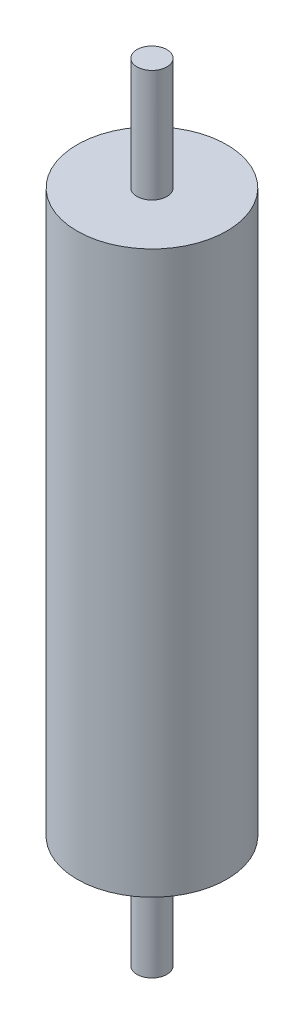
ISO-10303-21;
HEADER;
FILE_DESCRIPTION(('STEP AP214'),'2;1');
FILE_NAME('part.step','',(''),(''),'','','');
FILE_SCHEMA(('AUTOMOTIVE_DESIGN { 1 0 10303 214 1 1 1 1 }'));
ENDSEC;
DATA;
#1=APPLICATION_CONTEXT('core data for automotive mechanical design processes');
#2=APPLICATION_PROTOCOL_DEFINITION('international standard','automotive_design',2000,#1);
#3=PRODUCT_CONTEXT('',#1,'mechanical');
#4=PRODUCT('Part','Part','',(#3));
#5=PRODUCT_RELATED_PRODUCT_CATEGORY('part','',(#4));
#6=PRODUCT_DEFINITION_FORMATION('','',#4);
#7=PRODUCT_DEFINITION_CONTEXT('part definition',#1,'design');
#8=PRODUCT_DEFINITION('design','',#6,#7);
#9=PRODUCT_DEFINITION_SHAPE('','',#8);
#10=(LENGTH_UNIT() NAMED_UNIT(*) SI_UNIT(.MILLI.,.METRE.));
#11=(NAMED_UNIT(*) PLANE_ANGLE_UNIT() SI_UNIT($,.RADIAN.));
#12=(NAMED_UNIT(*) SI_UNIT($,.STERADIAN.) SOLID_ANGLE_UNIT());
#13=UNCERTAINTY_MEASURE_WITH_UNIT(LENGTH_MEASURE(1.E-05),#10,'distance_accuracy_value','');
#14=(GEOMETRIC_REPRESENTATION_CONTEXT(3) GLOBAL_UNCERTAINTY_ASSIGNED_CONTEXT((#13)) GLOBAL_UNIT_ASSIGNED_CONTEXT((#10,
#11,#12)) REPRESENTATION_CONTEXT('',''));
#15=CARTESIAN_POINT('',(0.,0.,0.));
#16=DIRECTION('',(0.,0.,1.));
#17=DIRECTION('',(1.,0.,0.));
#18=AXIS2_PLACEMENT_3D('',#15,#16,#17);
#19=CARTESIAN_POINT('',(0.,150.,0.));
#20=DIRECTION('',(0.,-1.,0.));
#21=DIRECTION('',(0.,0.,-1.));
#22=AXIS2_PLACEMENT_3D('',#19,#20,#21);
#23=CYLINDRICAL_SURFACE('',#22,20.);
#24=CARTESIAN_POINT('',(0.,150.,0.));
#25=DIRECTION('',(0.,1.,0.));
#26=DIRECTION('',(0.,0.,1.));
#27=AXIS2_PLACEMENT_3D('',#24,#25,#26);
#28=CIRCLE('',#27,20.);
#29=CARTESIAN_POINT('',(0.,150.,20.));
#30=VERTEX_POINT('',#29);
#31=EDGE_CURVE('E41',#30,#30,#28,.T.);
#32=ORIENTED_EDGE('',*,*,#31,.F.);
#33=EDGE_LOOP('',(#32));
#34=FACE_BOUND('',#33,.T.);
#35=CARTESIAN_POINT('',(0.,0.,0.));
#36=DIRECTION('',(0.,1.,0.));
#37=DIRECTION('',(0.,0.,1.));
#38=AXIS2_PLACEMENT_3D('',#35,#36,#37);
#39=CIRCLE('',#38,20.);
#40=CARTESIAN_POINT('',(0.,0.,20.));
#41=VERTEX_POINT('',#40);
#42=EDGE_CURVE('E45',#41,#41,#39,.T.);
#43=ORIENTED_EDGE('',*,*,#42,.T.);
#44=EDGE_LOOP('',(#43));
#45=FACE_BOUND('',#44,.T.);
#46=ADVANCED_FACE('F31',(#34,#45),#23,.T.);
#47=CARTESIAN_POINT('',(0.,150.,0.));
#48=DIRECTION('',(0.,1.,0.));
#49=DIRECTION('',(0.,0.,1.));
#50=AXIS2_PLACEMENT_3D('',#47,#48,#49);
#51=PLANE('',#50);
#52=CARTESIAN_POINT('',(0.,150.,0.));
#53=DIRECTION('',(0.,1.,0.));
#54=DIRECTION('',(0.,0.,1.));
#55=AXIS2_PLACEMENT_3D('',#52,#53,#54);
#56=CIRCLE('',#55,4.);
#57=CARTESIAN_POINT('',(0.,150.,4.));
#58=VERTEX_POINT('',#57);
#59=EDGE_CURVE('E10',#58,#58,#56,.T.);
#60=ORIENTED_EDGE('',*,*,#59,.F.);
#61=EDGE_LOOP('',(#60));
#62=FACE_BOUND('',#61,.T.);
#63=ORIENTED_EDGE('',*,*,#31,.T.);
#64=EDGE_LOOP('',(#63));
#65=FACE_BOUND('',#64,.T.);
#66=ADVANCED_FACE('F68',(#62,#65),#51,.T.);
#67=CARTESIAN_POINT('',(0.,0.,0.));
#68=DIRECTION('',(0.,1.,0.));
#69=DIRECTION('',(0.,0.,1.));
#70=AXIS2_PLACEMENT_3D('',#67,#68,#69);
#71=PLANE('',#70);
#72=CARTESIAN_POINT('',(0.,0.,0.));
#73=DIRECTION('',(0.,1.,0.));
#74=DIRECTION('',(0.,0.,1.));
#75=AXIS2_PLACEMENT_3D('',#72,#73,#74);
#76=CIRCLE('',#75,4.);
#77=CARTESIAN_POINT('',(0.,0.,4.));
#78=VERTEX_POINT('',#77);
#79=EDGE_CURVE('E37',#78,#78,#76,.F.);
#80=ORIENTED_EDGE('',*,*,#79,.F.);
#81=EDGE_LOOP('',(#80));
#82=FACE_BOUND('',#81,.T.);
#83=ORIENTED_EDGE('',*,*,#42,.F.);
#84=EDGE_LOOP('',(#83));
#85=FACE_BOUND('',#84,.T.);
#86=ADVANCED_FACE('F73',(#82,#85),#71,.F.);
#87=CARTESIAN_POINT('',(0.,-30.,0.));
#88=DIRECTION('',(0.,1.,0.));
#89=DIRECTION('',(0.,0.,1.));
#90=AXIS2_PLACEMENT_3D('',#87,#88,#89);
#91=CYLINDRICAL_SURFACE('',#90,4.);
#92=CARTESIAN_POINT('',(0.,-30.,0.));
#93=DIRECTION('',(0.,-1.,0.));
#94=DIRECTION('',(0.,0.,-1.));
#95=AXIS2_PLACEMENT_3D('',#92,#93,#94);
#96=CIRCLE('',#95,4.);
#97=CARTESIAN_POINT('',(0.,-30.,-4.));
#98=VERTEX_POINT('',#97);
#99=EDGE_CURVE('E49',#98,#98,#96,.T.);
#100=ORIENTED_EDGE('',*,*,#99,.F.);
#101=EDGE_LOOP('',(#100));
#102=FACE_BOUND('',#101,.T.);
#103=ORIENTED_EDGE('',*,*,#79,.T.);
#104=EDGE_LOOP('',(#103));
#105=FACE_BOUND('',#104,.T.);
#106=ADVANCED_FACE('F81',(#102,#105),#91,.T.);
#107=CARTESIAN_POINT('',(0.,-30.,0.));
#108=DIRECTION('',(0.,-1.,0.));
#109=DIRECTION('',(0.,0.,-1.));
#110=AXIS2_PLACEMENT_3D('',#107,#108,#109);
#111=PLANE('',#110);
#112=ORIENTED_EDGE('',*,*,#99,.T.);
#113=EDGE_LOOP('',(#112));
#114=FACE_BOUND('',#113,.T.);
#115=ADVANCED_FACE('F65',(#114),#111,.T.);
#116=CARTESIAN_POINT('',(0.,180.,0.));
#117=DIRECTION('',(0.,-1.,0.));
#118=DIRECTION('',(0.,0.,-1.));
#119=AXIS2_PLACEMENT_3D('',#116,#117,#118);
#120=CYLINDRICAL_SURFACE('',#119,4.);
#121=CARTESIAN_POINT('',(0.,180.,0.));
#122=DIRECTION('',(0.,-1.,0.));
#123=DIRECTION('',(0.,0.,-1.));
#124=AXIS2_PLACEMENT_3D('',#121,#122,#123);
#125=CIRCLE('',#124,4.);
#126=CARTESIAN_POINT('',(0.,180.,-4.));
#127=VERTEX_POINT('',#126);
#128=EDGE_CURVE('E53',#127,#127,#125,.T.);
#129=ORIENTED_EDGE('',*,*,#128,.T.);
#130=EDGE_LOOP('',(#129));
#131=FACE_BOUND('',#130,.T.);
#132=ORIENTED_EDGE('',*,*,#59,.T.);
#133=EDGE_LOOP('',(#132));
#134=FACE_BOUND('',#133,.T.);
#135=ADVANCED_FACE('F57',(#131,#134),#120,.T.);
#136=CARTESIAN_POINT('',(0.,180.,0.));
#137=DIRECTION('',(0.,1.,0.));
#138=DIRECTION('',(0.,0.,-1.));
#139=AXIS2_PLACEMENT_3D('',#136,#137,#138);
#140=PLANE('',#139);
#141=ORIENTED_EDGE('',*,*,#128,.F.);
#142=EDGE_LOOP('',(#141));
#143=FACE_BOUND('',#142,.T.);
#144=ADVANCED_FACE('F59',(#143),#140,.T.);
#145=CLOSED_SHELL('',(#46,#66,#86,#106,#115,#135,#144));
#146=MANIFOLD_SOLID_BREP('B2',#145);
#147=ADVANCED_BREP_SHAPE_REPRESENTATION('',(#18,#146),#14);
#148=SHAPE_DEFINITION_REPRESENTATION(#9,#147);
ENDSEC;
END-ISO-10303-21;
